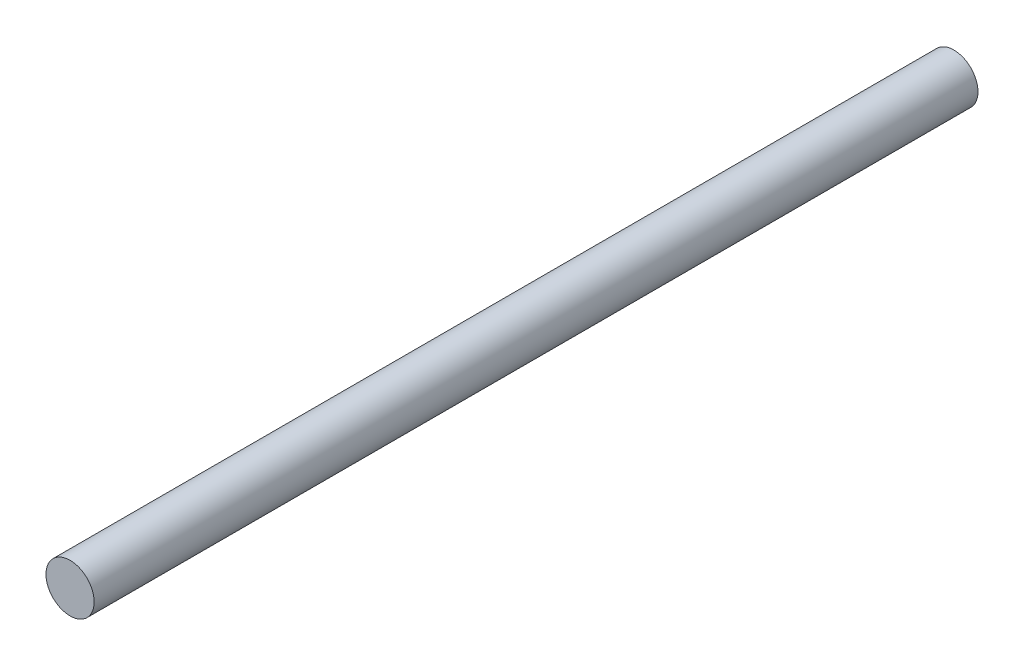
ISO-10303-21;
HEADER;
FILE_DESCRIPTION(('STEP AP214'),'2;1');
FILE_NAME('part.step','',(''),(''),'','','');
FILE_SCHEMA(('AUTOMOTIVE_DESIGN { 1 0 10303 214 1 1 1 1 }'));
ENDSEC;
DATA;
#1=APPLICATION_CONTEXT('core data for automotive mechanical design processes');
#2=APPLICATION_PROTOCOL_DEFINITION('international standard','automotive_design',2000,#1);
#3=PRODUCT_CONTEXT('',#1,'mechanical');
#4=PRODUCT('Part','Part','',(#3));
#5=PRODUCT_RELATED_PRODUCT_CATEGORY('part','',(#4));
#6=PRODUCT_DEFINITION_FORMATION('','',#4);
#7=PRODUCT_DEFINITION_CONTEXT('part definition',#1,'design');
#8=PRODUCT_DEFINITION('design','',#6,#7);
#9=PRODUCT_DEFINITION_SHAPE('','',#8);
#10=(LENGTH_UNIT() NAMED_UNIT(*) SI_UNIT(.MILLI.,.METRE.));
#11=(NAMED_UNIT(*) PLANE_ANGLE_UNIT() SI_UNIT($,.RADIAN.));
#12=(NAMED_UNIT(*) SI_UNIT($,.STERADIAN.) SOLID_ANGLE_UNIT());
#13=UNCERTAINTY_MEASURE_WITH_UNIT(LENGTH_MEASURE(1.E-05),#10,'distance_accuracy_value','');
#14=(GEOMETRIC_REPRESENTATION_CONTEXT(3) GLOBAL_UNCERTAINTY_ASSIGNED_CONTEXT((#13)) GLOBAL_UNIT_ASSIGNED_CONTEXT((#10,
#11,#12)) REPRESENTATION_CONTEXT('',''));
#15=CARTESIAN_POINT('',(0.,0.,0.));
#16=DIRECTION('',(0.,0.,1.));
#17=DIRECTION('',(1.,0.,0.));
#18=AXIS2_PLACEMENT_3D('',#15,#16,#17);
#19=CARTESIAN_POINT('',(0.,0.,110.));
#20=DIRECTION('',(0.,0.,-1.));
#21=DIRECTION('',(-1.,0.,0.));
#22=AXIS2_PLACEMENT_3D('',#19,#20,#21);
#23=CYLINDRICAL_SURFACE('',#22,3.);
#24=CARTESIAN_POINT('',(0.,0.,110.));
#25=DIRECTION('',(0.,0.,1.));
#26=DIRECTION('',(1.,0.,0.));
#27=AXIS2_PLACEMENT_3D('',#24,#25,#26);
#28=CIRCLE('',#27,3.);
#29=CARTESIAN_POINT('',(3.,0.,110.));
#30=VERTEX_POINT('',#29);
#31=EDGE_CURVE('E10',#30,#30,#28,.T.);
#32=ORIENTED_EDGE('',*,*,#31,.F.);
#33=EDGE_LOOP('',(#32));
#34=FACE_BOUND('',#33,.T.);
#35=CARTESIAN_POINT('',(0.,0.,0.));
#36=DIRECTION('',(0.,0.,1.));
#37=DIRECTION('',(1.,0.,0.));
#38=AXIS2_PLACEMENT_3D('',#35,#36,#37);
#39=CIRCLE('',#38,3.);
#40=CARTESIAN_POINT('',(3.,0.,0.));
#41=VERTEX_POINT('',#40);
#42=EDGE_CURVE('E34',#41,#41,#39,.T.);
#43=ORIENTED_EDGE('',*,*,#42,.T.);
#44=EDGE_LOOP('',(#43));
#45=FACE_BOUND('',#44,.T.);
#46=ADVANCED_FACE('F31',(#34,#45),#23,.T.);
#47=CARTESIAN_POINT('',(0.,0.,110.));
#48=DIRECTION('',(0.,0.,1.));
#49=DIRECTION('',(1.,0.,0.));
#50=AXIS2_PLACEMENT_3D('',#47,#48,#49);
#51=PLANE('',#50);
#52=ORIENTED_EDGE('',*,*,#31,.T.);
#53=EDGE_LOOP('',(#52));
#54=FACE_BOUND('',#53,.T.);
#55=ADVANCED_FACE('F46',(#54),#51,.T.);
#56=CARTESIAN_POINT('',(0.,0.,0.));
#57=DIRECTION('',(0.,0.,1.));
#58=DIRECTION('',(1.,0.,0.));
#59=AXIS2_PLACEMENT_3D('',#56,#57,#58);
#60=PLANE('',#59);
#61=ORIENTED_EDGE('',*,*,#42,.F.);
#62=EDGE_LOOP('',(#61));
#63=FACE_BOUND('',#62,.T.);
#64=ADVANCED_FACE('F44',(#63),#60,.F.);
#65=CLOSED_SHELL('',(#46,#55,#64));
#66=MANIFOLD_SOLID_BREP('B2',#65);
#67=ADVANCED_BREP_SHAPE_REPRESENTATION('',(#18,#66),#14);
#68=SHAPE_DEFINITION_REPRESENTATION(#9,#67);
ENDSEC;
END-ISO-10303-21;
